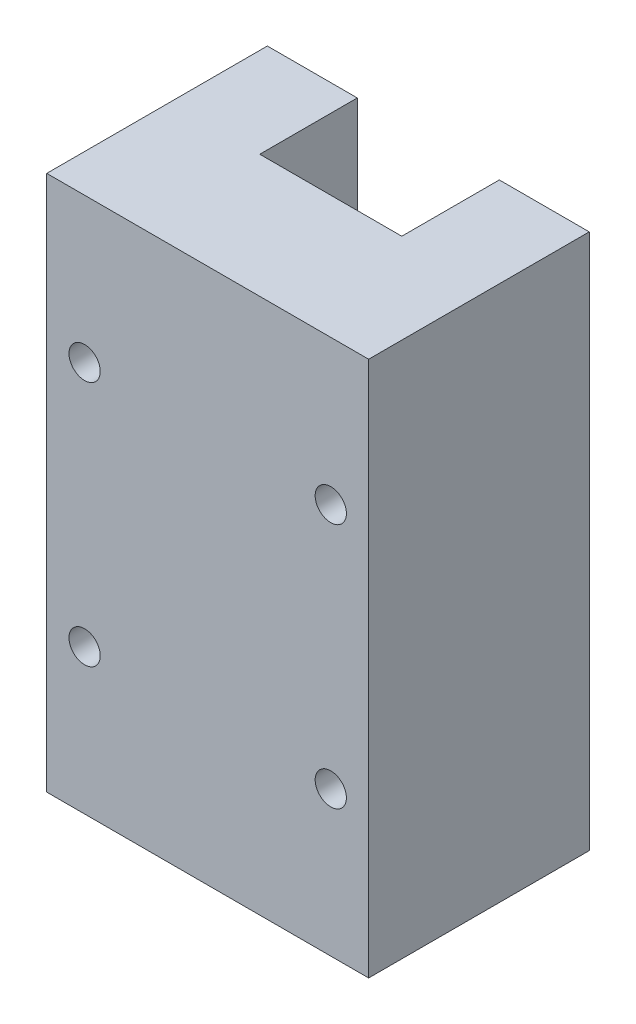
ISO-10303-21;
HEADER;
FILE_DESCRIPTION(('STEP AP214'),'2;1');
FILE_NAME('part.step','',(''),(''),'','','');
FILE_SCHEMA(('AUTOMOTIVE_DESIGN { 1 0 10303 214 1 1 1 1 }'));
ENDSEC;
DATA;
#1=APPLICATION_CONTEXT('core data for automotive mechanical design processes');
#2=APPLICATION_PROTOCOL_DEFINITION('international standard','automotive_design',2000,#1);
#3=PRODUCT_CONTEXT('',#1,'mechanical');
#4=PRODUCT('Part','Part','',(#3));
#5=PRODUCT_RELATED_PRODUCT_CATEGORY('part','',(#4));
#6=PRODUCT_DEFINITION_FORMATION('','',#4);
#7=PRODUCT_DEFINITION_CONTEXT('part definition',#1,'design');
#8=PRODUCT_DEFINITION('design','',#6,#7);
#9=PRODUCT_DEFINITION_SHAPE('','',#8);
#10=(LENGTH_UNIT() NAMED_UNIT(*) SI_UNIT(.MILLI.,.METRE.));
#11=(NAMED_UNIT(*) PLANE_ANGLE_UNIT() SI_UNIT($,.RADIAN.));
#12=(NAMED_UNIT(*) SI_UNIT($,.STERADIAN.) SOLID_ANGLE_UNIT());
#13=UNCERTAINTY_MEASURE_WITH_UNIT(LENGTH_MEASURE(1.E-05),#10,'distance_accuracy_value','');
#14=(GEOMETRIC_REPRESENTATION_CONTEXT(3) GLOBAL_UNCERTAINTY_ASSIGNED_CONTEXT((#13)) GLOBAL_UNIT_ASSIGNED_CONTEXT((#10,
#11,#12)) REPRESENTATION_CONTEXT('',''));
#15=CARTESIAN_POINT('',(0.,0.,0.));
#16=DIRECTION('',(0.,0.,1.));
#17=DIRECTION('',(1.,0.,0.));
#18=AXIS2_PLACEMENT_3D('',#15,#16,#17);
#19=CARTESIAN_POINT('',(-17.,28.3,-23.3));
#20=DIRECTION('',(0.,0.,1.));
#21=DIRECTION('',(1.,0.,0.));
#22=AXIS2_PLACEMENT_3D('',#19,#20,#21);
#23=PLANE('',#22);
#24=DIRECTION('',(-1.,0.,0.));
#25=VECTOR('',#24,1.);
#26=CARTESIAN_POINT('',(-17.,28.3,-23.3));
#27=LINE('',#26,#25);
#28=CARTESIAN_POINT('',(-7.5,28.3,-23.3));
#29=VERTEX_POINT('',#28);
#30=CARTESIAN_POINT('',(-17.,28.3,-23.3));
#31=VERTEX_POINT('',#30);
#32=EDGE_CURVE('E60',#29,#31,#27,.T.);
#33=ORIENTED_EDGE('',*,*,#32,.F.);
#34=DIRECTION('',(0.,1.,0.));
#35=VECTOR('',#34,1.);
#36=CARTESIAN_POINT('',(-7.5,-28.3,-23.3));
#37=LINE('',#36,#35);
#38=CARTESIAN_POINT('',(-7.5,-28.3,-23.3));
#39=VERTEX_POINT('',#38);
#40=EDGE_CURVE('E170',#39,#29,#37,.T.);
#41=ORIENTED_EDGE('',*,*,#40,.F.);
#42=DIRECTION('',(-1.,0.,0.));
#43=VECTOR('',#42,1.);
#44=CARTESIAN_POINT('',(-17.,-28.3,-23.3));
#45=LINE('',#44,#43);
#46=CARTESIAN_POINT('',(-17.,-28.3,-23.3));
#47=VERTEX_POINT('',#46);
#48=EDGE_CURVE('E82',#39,#47,#45,.T.);
#49=ORIENTED_EDGE('',*,*,#48,.T.);
#50=DIRECTION('',(0.,-1.,0.));
#51=VECTOR('',#50,1.);
#52=CARTESIAN_POINT('',(-17.,28.3,-23.3));
#53=LINE('',#52,#51);
#54=EDGE_CURVE('E188',#31,#47,#53,.T.);
#55=ORIENTED_EDGE('',*,*,#54,.F.);
#56=EDGE_LOOP('',(#33,#41,#49,#55));
#57=FACE_BOUND('',#56,.T.);
#58=ADVANCED_FACE('F36',(#57),#23,.F.);
#59=CARTESIAN_POINT('',(-17.,28.3,-23.3));
#60=DIRECTION('',(1.,0.,0.));
#61=DIRECTION('',(0.,0.,-1.));
#62=AXIS2_PLACEMENT_3D('',#59,#60,#61);
#63=PLANE('',#62);
#64=DIRECTION('',(0.,0.,1.));
#65=VECTOR('',#64,1.);
#66=CARTESIAN_POINT('',(-17.,-28.3,-23.3));
#67=LINE('',#66,#65);
#68=CARTESIAN_POINT('',(-17.,-28.3,0.));
#69=VERTEX_POINT('',#68);
#70=EDGE_CURVE('E172',#47,#69,#67,.T.);
#71=ORIENTED_EDGE('',*,*,#70,.T.);
#72=DIRECTION('',(0.,-1.,0.));
#73=VECTOR('',#72,1.);
#74=CARTESIAN_POINT('',(-17.,28.3,0.));
#75=LINE('',#74,#73);
#76=CARTESIAN_POINT('',(-17.,28.3,0.));
#77=VERTEX_POINT('',#76);
#78=EDGE_CURVE('E11',#77,#69,#75,.T.);
#79=ORIENTED_EDGE('',*,*,#78,.F.);
#80=DIRECTION('',(0.,0.,1.));
#81=VECTOR('',#80,1.);
#82=CARTESIAN_POINT('',(-17.,28.3,-23.3));
#83=LINE('',#82,#81);
#84=EDGE_CURVE('E179',#31,#77,#83,.T.);
#85=ORIENTED_EDGE('',*,*,#84,.F.);
#86=ORIENTED_EDGE('',*,*,#54,.T.);
#87=EDGE_LOOP('',(#71,#79,#85,#86));
#88=FACE_BOUND('',#87,.T.);
#89=ADVANCED_FACE('F38',(#88),#63,.F.);
#90=CARTESIAN_POINT('',(-17.,28.3,0.));
#91=DIRECTION('',(0.,0.,-1.));
#92=DIRECTION('',(-1.,0.,0.));
#93=AXIS2_PLACEMENT_3D('',#90,#91,#92);
#94=PLANE('',#93);
#95=CARTESIAN_POINT('',(-13.,13.,0.));
#96=DIRECTION('',(0.,0.,1.));
#97=DIRECTION('',(1.,0.,0.));
#98=AXIS2_PLACEMENT_3D('',#95,#96,#97);
#99=CIRCLE('',#98,1.64999999999999);
#100=CARTESIAN_POINT('',(-11.35,13.,0.));
#101=VERTEX_POINT('',#100);
#102=EDGE_CURVE('E132',#101,#101,#99,.T.);
#103=ORIENTED_EDGE('',*,*,#102,.F.);
#104=EDGE_LOOP('',(#103));
#105=FACE_BOUND('',#104,.T.);
#106=CARTESIAN_POINT('',(-13.,-13.,0.));
#107=DIRECTION('',(0.,0.,1.));
#108=DIRECTION('',(1.,0.,0.));
#109=AXIS2_PLACEMENT_3D('',#106,#107,#108);
#110=CIRCLE('',#109,1.64999999999999);
#111=CARTESIAN_POINT('',(-11.35,-13.,0.));
#112=VERTEX_POINT('',#111);
#113=EDGE_CURVE('E131',#112,#112,#110,.T.);
#114=ORIENTED_EDGE('',*,*,#113,.F.);
#115=EDGE_LOOP('',(#114));
#116=FACE_BOUND('',#115,.T.);
#117=CARTESIAN_POINT('',(13.,-13.,0.));
#118=DIRECTION('',(0.,0.,1.));
#119=DIRECTION('',(1.,0.,0.));
#120=AXIS2_PLACEMENT_3D('',#117,#118,#119);
#121=CIRCLE('',#120,1.64999999999999);
#122=CARTESIAN_POINT('',(14.65,-13.,0.));
#123=VERTEX_POINT('',#122);
#124=EDGE_CURVE('E142',#123,#123,#121,.T.);
#125=ORIENTED_EDGE('',*,*,#124,.F.);
#126=EDGE_LOOP('',(#125));
#127=FACE_BOUND('',#126,.T.);
#128=CARTESIAN_POINT('',(13.,13.,0.));
#129=DIRECTION('',(0.,0.,1.));
#130=DIRECTION('',(1.,0.,0.));
#131=AXIS2_PLACEMENT_3D('',#128,#129,#130);
#132=CIRCLE('',#131,1.64999999999999);
#133=CARTESIAN_POINT('',(14.65,13.,0.));
#134=VERTEX_POINT('',#133);
#135=EDGE_CURVE('E148',#134,#134,#132,.T.);
#136=ORIENTED_EDGE('',*,*,#135,.F.);
#137=EDGE_LOOP('',(#136));
#138=FACE_BOUND('',#137,.T.);
#139=DIRECTION('',(1.,0.,0.));
#140=VECTOR('',#139,1.);
#141=CARTESIAN_POINT('',(-17.,-28.3,0.));
#142=LINE('',#141,#140);
#143=CARTESIAN_POINT('',(17.,-28.3,0.));
#144=VERTEX_POINT('',#143);
#145=EDGE_CURVE('E191',#69,#144,#142,.T.);
#146=ORIENTED_EDGE('',*,*,#145,.T.);
#147=DIRECTION('',(0.,-1.,0.));
#148=VECTOR('',#147,1.);
#149=CARTESIAN_POINT('',(17.,28.3,0.));
#150=LINE('',#149,#148);
#151=CARTESIAN_POINT('',(17.,28.3,0.));
#152=VERTEX_POINT('',#151);
#153=EDGE_CURVE('E44',#152,#144,#150,.T.);
#154=ORIENTED_EDGE('',*,*,#153,.F.);
#155=DIRECTION('',(1.,0.,0.));
#156=VECTOR('',#155,1.);
#157=CARTESIAN_POINT('',(-17.,28.3,0.));
#158=LINE('',#157,#156);
#159=EDGE_CURVE('E89',#77,#152,#158,.T.);
#160=ORIENTED_EDGE('',*,*,#159,.F.);
#161=ORIENTED_EDGE('',*,*,#78,.T.);
#162=EDGE_LOOP('',(#146,#154,#160,#161));
#163=FACE_BOUND('',#162,.T.);
#164=ADVANCED_FACE('F219',(#105,#116,#127,#138,#163),#94,.F.);
#165=CARTESIAN_POINT('',(17.,28.3,-23.3));
#166=DIRECTION('',(-1.,0.,0.));
#167=DIRECTION('',(0.,0.,1.));
#168=AXIS2_PLACEMENT_3D('',#165,#166,#167);
#169=PLANE('',#168);
#170=DIRECTION('',(0.,0.,-1.));
#171=VECTOR('',#170,1.);
#172=CARTESIAN_POINT('',(17.,-28.3,-23.3));
#173=LINE('',#172,#171);
#174=CARTESIAN_POINT('',(17.,-28.3,-23.3));
#175=VERTEX_POINT('',#174);
#176=EDGE_CURVE('E193',#144,#175,#173,.T.);
#177=ORIENTED_EDGE('',*,*,#176,.T.);
#178=DIRECTION('',(0.,-1.,0.));
#179=VECTOR('',#178,1.);
#180=CARTESIAN_POINT('',(17.,28.3,-23.3));
#181=LINE('',#180,#179);
#182=CARTESIAN_POINT('',(17.,28.3,-23.3));
#183=VERTEX_POINT('',#182);
#184=EDGE_CURVE('E198',#183,#175,#181,.T.);
#185=ORIENTED_EDGE('',*,*,#184,.F.);
#186=DIRECTION('',(0.,0.,-1.));
#187=VECTOR('',#186,1.);
#188=CARTESIAN_POINT('',(17.,28.3,-23.3));
#189=LINE('',#188,#187);
#190=EDGE_CURVE('E183',#152,#183,#189,.T.);
#191=ORIENTED_EDGE('',*,*,#190,.F.);
#192=ORIENTED_EDGE('',*,*,#153,.T.);
#193=EDGE_LOOP('',(#177,#185,#191,#192));
#194=FACE_BOUND('',#193,.T.);
#195=ADVANCED_FACE('F204',(#194),#169,.F.);
#196=CARTESIAN_POINT('',(7.5,-28.3,-23.3));
#197=VERTEX_POINT('',#196);
#198=EDGE_CURVE('E181',#175,#197,#45,.T.);
#199=ORIENTED_EDGE('',*,*,#198,.T.);
#200=DIRECTION('',(0.,1.,0.));
#201=VECTOR('',#200,1.);
#202=CARTESIAN_POINT('',(7.5,-28.3,-23.3));
#203=LINE('',#202,#201);
#204=CARTESIAN_POINT('',(7.5,28.3,-23.3));
#205=VERTEX_POINT('',#204);
#206=EDGE_CURVE('E173',#197,#205,#203,.T.);
#207=ORIENTED_EDGE('',*,*,#206,.T.);
#208=EDGE_CURVE('E185',#183,#205,#27,.T.);
#209=ORIENTED_EDGE('',*,*,#208,.F.);
#210=ORIENTED_EDGE('',*,*,#184,.T.);
#211=EDGE_LOOP('',(#199,#207,#209,#210));
#212=FACE_BOUND('',#211,.T.);
#213=ADVANCED_FACE('F211',(#212),#23,.F.);
#214=CARTESIAN_POINT('',(-17.,28.3,0.));
#215=DIRECTION('',(0.,1.,0.));
#216=DIRECTION('',(0.,0.,1.));
#217=AXIS2_PLACEMENT_3D('',#214,#215,#216);
#218=PLANE('',#217);
#219=DIRECTION('',(0.,0.,1.));
#220=VECTOR('',#219,1.);
#221=CARTESIAN_POINT('',(-7.5,28.3,-23.3));
#222=LINE('',#221,#220);
#223=CARTESIAN_POINT('',(-7.5,28.3,-13.));
#224=VERTEX_POINT('',#223);
#225=EDGE_CURVE('E154',#29,#224,#222,.T.);
#226=ORIENTED_EDGE('',*,*,#225,.F.);
#227=ORIENTED_EDGE('',*,*,#32,.T.);
#228=ORIENTED_EDGE('',*,*,#84,.T.);
#229=ORIENTED_EDGE('',*,*,#159,.T.);
#230=ORIENTED_EDGE('',*,*,#190,.T.);
#231=ORIENTED_EDGE('',*,*,#208,.T.);
#232=DIRECTION('',(0.,0.,-1.));
#233=VECTOR('',#232,1.);
#234=CARTESIAN_POINT('',(7.5,28.3,-23.3));
#235=LINE('',#234,#233);
#236=CARTESIAN_POINT('',(7.5,28.3,-13.));
#237=VERTEX_POINT('',#236);
#238=EDGE_CURVE('E159',#237,#205,#235,.T.);
#239=ORIENTED_EDGE('',*,*,#238,.F.);
#240=DIRECTION('',(1.,0.,0.));
#241=VECTOR('',#240,1.);
#242=CARTESIAN_POINT('',(-7.5,28.3,-13.));
#243=LINE('',#242,#241);
#244=EDGE_CURVE('E166',#224,#237,#243,.T.);
#245=ORIENTED_EDGE('',*,*,#244,.F.);
#246=EDGE_LOOP('',(#226,#227,#228,#229,#230,#231,#239,#245));
#247=FACE_BOUND('',#246,.T.);
#248=ADVANCED_FACE('F214',(#247),#218,.T.);
#249=CARTESIAN_POINT('',(-17.,-28.3,0.));
#250=DIRECTION('',(0.,1.,0.));
#251=DIRECTION('',(0.,0.,1.));
#252=AXIS2_PLACEMENT_3D('',#249,#250,#251);
#253=PLANE('',#252);
#254=ORIENTED_EDGE('',*,*,#48,.F.);
#255=DIRECTION('',(0.,0.,1.));
#256=VECTOR('',#255,1.);
#257=CARTESIAN_POINT('',(-7.5,-28.3,-23.3));
#258=LINE('',#257,#256);
#259=CARTESIAN_POINT('',(-7.5,-28.3,-13.));
#260=VERTEX_POINT('',#259);
#261=EDGE_CURVE('E155',#39,#260,#258,.T.);
#262=ORIENTED_EDGE('',*,*,#261,.T.);
#263=DIRECTION('',(1.,0.,0.));
#264=VECTOR('',#263,1.);
#265=CARTESIAN_POINT('',(-7.5,-28.3,-13.));
#266=LINE('',#265,#264);
#267=CARTESIAN_POINT('',(7.5,-28.3,-13.));
#268=VERTEX_POINT('',#267);
#269=EDGE_CURVE('E158',#260,#268,#266,.T.);
#270=ORIENTED_EDGE('',*,*,#269,.T.);
#271=DIRECTION('',(0.,0.,-1.));
#272=VECTOR('',#271,1.);
#273=CARTESIAN_POINT('',(7.5,-28.3,-23.3));
#274=LINE('',#273,#272);
#275=EDGE_CURVE('E51',#268,#197,#274,.T.);
#276=ORIENTED_EDGE('',*,*,#275,.T.);
#277=ORIENTED_EDGE('',*,*,#198,.F.);
#278=ORIENTED_EDGE('',*,*,#176,.F.);
#279=ORIENTED_EDGE('',*,*,#145,.F.);
#280=ORIENTED_EDGE('',*,*,#70,.F.);
#281=EDGE_LOOP('',(#254,#262,#270,#276,#277,#278,#279,#280));
#282=FACE_BOUND('',#281,.T.);
#283=ADVANCED_FACE('F208',(#282),#253,.F.);
#284=CARTESIAN_POINT('',(-7.5,-28.3,-23.3));
#285=DIRECTION('',(-1.,0.,0.));
#286=DIRECTION('',(0.,0.,1.));
#287=AXIS2_PLACEMENT_3D('',#284,#285,#286);
#288=PLANE('',#287);
#289=ORIENTED_EDGE('',*,*,#225,.T.);
#290=DIRECTION('',(0.,1.,0.));
#291=VECTOR('',#290,1.);
#292=CARTESIAN_POINT('',(-7.5,-28.3,-13.));
#293=LINE('',#292,#291);
#294=EDGE_CURVE('E163',#260,#224,#293,.T.);
#295=ORIENTED_EDGE('',*,*,#294,.F.);
#296=ORIENTED_EDGE('',*,*,#261,.F.);
#297=ORIENTED_EDGE('',*,*,#40,.T.);
#298=EDGE_LOOP('',(#289,#295,#296,#297));
#299=FACE_BOUND('',#298,.T.);
#300=ADVANCED_FACE('F242',(#299),#288,.F.);
#301=CARTESIAN_POINT('',(7.5,-28.3,-23.3));
#302=DIRECTION('',(1.,0.,0.));
#303=DIRECTION('',(0.,0.,-1.));
#304=AXIS2_PLACEMENT_3D('',#301,#302,#303);
#305=PLANE('',#304);
#306=ORIENTED_EDGE('',*,*,#238,.T.);
#307=ORIENTED_EDGE('',*,*,#206,.F.);
#308=ORIENTED_EDGE('',*,*,#275,.F.);
#309=DIRECTION('',(0.,1.,0.));
#310=VECTOR('',#309,1.);
#311=CARTESIAN_POINT('',(7.5,-28.3,-13.));
#312=LINE('',#311,#310);
#313=EDGE_CURVE('E176',#268,#237,#312,.T.);
#314=ORIENTED_EDGE('',*,*,#313,.T.);
#315=EDGE_LOOP('',(#306,#307,#308,#314));
#316=FACE_BOUND('',#315,.T.);
#317=ADVANCED_FACE('F246',(#316),#305,.F.);
#318=CARTESIAN_POINT('',(-7.5,-28.3,-13.));
#319=DIRECTION('',(0.,0.,1.));
#320=DIRECTION('',(1.,0.,0.));
#321=AXIS2_PLACEMENT_3D('',#318,#319,#320);
#322=PLANE('',#321);
#323=ORIENTED_EDGE('',*,*,#244,.T.);
#324=ORIENTED_EDGE('',*,*,#313,.F.);
#325=ORIENTED_EDGE('',*,*,#269,.F.);
#326=ORIENTED_EDGE('',*,*,#294,.T.);
#327=EDGE_LOOP('',(#323,#324,#325,#326));
#328=FACE_BOUND('',#327,.T.);
#329=ADVANCED_FACE('F248',(#328),#322,.F.);
#330=CARTESIAN_POINT('',(13.,13.,-10.1));
#331=DIRECTION('',(0.,0.,1.));
#332=DIRECTION('',(1.,0.,0.));
#333=AXIS2_PLACEMENT_3D('',#330,#331,#332);
#334=CONICAL_SURFACE('',#333,1.65,1.02974425867665);
#335=CARTESIAN_POINT('',(13.,13.,-11.0914200213955));
#336=VERTEX_POINT('',#335);
#337=VERTEX_LOOP('',#336);
#338=FACE_BOUND('',#337,.T.);
#339=CARTESIAN_POINT('',(13.,13.,-10.1));
#340=DIRECTION('',(0.,0.,1.));
#341=DIRECTION('',(1.,0.,0.));
#342=AXIS2_PLACEMENT_3D('',#339,#340,#341);
#343=CIRCLE('',#342,1.65);
#344=CARTESIAN_POINT('',(14.65,13.,-10.1));
#345=VERTEX_POINT('',#344);
#346=EDGE_CURVE('E151',#345,#345,#343,.T.);
#347=ORIENTED_EDGE('',*,*,#346,.T.);
#348=EDGE_LOOP('',(#347));
#349=FACE_BOUND('',#348,.T.);
#350=ADVANCED_FACE('F251',(#338,#349),#334,.F.);
#351=CARTESIAN_POINT('',(13.,13.,0.));
#352=DIRECTION('',(0.,0.,1.));
#353=DIRECTION('',(1.,0.,0.));
#354=AXIS2_PLACEMENT_3D('',#351,#352,#353);
#355=CYLINDRICAL_SURFACE('',#354,1.64999999999999);
#356=ORIENTED_EDGE('',*,*,#346,.F.);
#357=EDGE_LOOP('',(#356));
#358=FACE_BOUND('',#357,.T.);
#359=ORIENTED_EDGE('',*,*,#135,.T.);
#360=EDGE_LOOP('',(#359));
#361=FACE_BOUND('',#360,.T.);
#362=ADVANCED_FACE('F257',(#358,#361),#355,.F.);
#363=CARTESIAN_POINT('',(13.,-13.,-10.1));
#364=DIRECTION('',(0.,0.,1.));
#365=DIRECTION('',(1.,0.,0.));
#366=AXIS2_PLACEMENT_3D('',#363,#364,#365);
#367=CONICAL_SURFACE('',#366,1.65,1.02974425867665);
#368=CARTESIAN_POINT('',(13.,-13.,-11.0914200213955));
#369=VERTEX_POINT('',#368);
#370=VERTEX_LOOP('',#369);
#371=FACE_BOUND('',#370,.T.);
#372=CARTESIAN_POINT('',(13.,-13.,-10.1));
#373=DIRECTION('',(0.,0.,1.));
#374=DIRECTION('',(1.,0.,0.));
#375=AXIS2_PLACEMENT_3D('',#372,#373,#374);
#376=CIRCLE('',#375,1.65);
#377=CARTESIAN_POINT('',(14.65,-13.,-10.1));
#378=VERTEX_POINT('',#377);
#379=EDGE_CURVE('E145',#378,#378,#376,.T.);
#380=ORIENTED_EDGE('',*,*,#379,.T.);
#381=EDGE_LOOP('',(#380));
#382=FACE_BOUND('',#381,.T.);
#383=ADVANCED_FACE('F261',(#371,#382),#367,.F.);
#384=CARTESIAN_POINT('',(13.,-13.,0.));
#385=DIRECTION('',(0.,0.,1.));
#386=DIRECTION('',(1.,0.,0.));
#387=AXIS2_PLACEMENT_3D('',#384,#385,#386);
#388=CYLINDRICAL_SURFACE('',#387,1.64999999999999);
#389=ORIENTED_EDGE('',*,*,#379,.F.);
#390=EDGE_LOOP('',(#389));
#391=FACE_BOUND('',#390,.T.);
#392=ORIENTED_EDGE('',*,*,#124,.T.);
#393=EDGE_LOOP('',(#392));
#394=FACE_BOUND('',#393,.T.);
#395=ADVANCED_FACE('F265',(#391,#394),#388,.F.);
#396=CARTESIAN_POINT('',(-13.,-13.,-10.1));
#397=DIRECTION('',(0.,0.,1.));
#398=DIRECTION('',(1.,0.,0.));
#399=AXIS2_PLACEMENT_3D('',#396,#397,#398);
#400=CONICAL_SURFACE('',#399,1.65,1.02974425867665);
#401=CARTESIAN_POINT('',(-13.,-13.,-11.0914200213955));
#402=VERTEX_POINT('',#401);
#403=VERTEX_LOOP('',#402);
#404=FACE_BOUND('',#403,.T.);
#405=CARTESIAN_POINT('',(-13.,-13.,-10.1));
#406=DIRECTION('',(0.,0.,1.));
#407=DIRECTION('',(1.,0.,0.));
#408=AXIS2_PLACEMENT_3D('',#405,#406,#407);
#409=CIRCLE('',#408,1.65);
#410=CARTESIAN_POINT('',(-11.35,-13.,-10.1));
#411=VERTEX_POINT('',#410);
#412=EDGE_CURVE('E135',#411,#411,#409,.T.);
#413=ORIENTED_EDGE('',*,*,#412,.T.);
#414=EDGE_LOOP('',(#413));
#415=FACE_BOUND('',#414,.T.);
#416=ADVANCED_FACE('F269',(#404,#415),#400,.F.);
#417=CARTESIAN_POINT('',(-13.,-13.,0.));
#418=DIRECTION('',(0.,0.,1.));
#419=DIRECTION('',(1.,0.,0.));
#420=AXIS2_PLACEMENT_3D('',#417,#418,#419);
#421=CYLINDRICAL_SURFACE('',#420,1.64999999999999);
#422=ORIENTED_EDGE('',*,*,#412,.F.);
#423=EDGE_LOOP('',(#422));
#424=FACE_BOUND('',#423,.T.);
#425=ORIENTED_EDGE('',*,*,#113,.T.);
#426=EDGE_LOOP('',(#425));
#427=FACE_BOUND('',#426,.T.);
#428=ADVANCED_FACE('F125',(#424,#427),#421,.F.);
#429=CARTESIAN_POINT('',(-13.,13.,-10.1));
#430=DIRECTION('',(0.,0.,1.));
#431=DIRECTION('',(1.,0.,0.));
#432=AXIS2_PLACEMENT_3D('',#429,#430,#431);
#433=CONICAL_SURFACE('',#432,1.65,1.02974425867665);
#434=CARTESIAN_POINT('',(-13.,13.,-11.0914200213955));
#435=VERTEX_POINT('',#434);
#436=VERTEX_LOOP('',#435);
#437=FACE_BOUND('',#436,.T.);
#438=CARTESIAN_POINT('',(-13.,13.,-10.1));
#439=DIRECTION('',(0.,0.,1.));
#440=DIRECTION('',(1.,0.,0.));
#441=AXIS2_PLACEMENT_3D('',#438,#439,#440);
#442=CIRCLE('',#441,1.65);
#443=CARTESIAN_POINT('',(-11.35,13.,-10.1));
#444=VERTEX_POINT('',#443);
#445=EDGE_CURVE('E129',#444,#444,#442,.T.);
#446=ORIENTED_EDGE('',*,*,#445,.T.);
#447=EDGE_LOOP('',(#446));
#448=FACE_BOUND('',#447,.T.);
#449=ADVANCED_FACE('F121',(#437,#448),#433,.F.);
#450=CARTESIAN_POINT('',(-13.,13.,0.));
#451=DIRECTION('',(0.,0.,1.));
#452=DIRECTION('',(1.,0.,0.));
#453=AXIS2_PLACEMENT_3D('',#450,#451,#452);
#454=CYLINDRICAL_SURFACE('',#453,1.64999999999999);
#455=ORIENTED_EDGE('',*,*,#445,.F.);
#456=EDGE_LOOP('',(#455));
#457=FACE_BOUND('',#456,.T.);
#458=ORIENTED_EDGE('',*,*,#102,.T.);
#459=EDGE_LOOP('',(#458));
#460=FACE_BOUND('',#459,.T.);
#461=ADVANCED_FACE('F124',(#457,#460),#454,.F.);
#462=CLOSED_SHELL('',(#58,#89,#164,#195,#213,#248,#283,#300,#317,#329,#350,#362,#383,#395,#416,
#428,#449,#461));
#463=MANIFOLD_SOLID_BREP('B2',#462);
#464=ADVANCED_BREP_SHAPE_REPRESENTATION('',(#18,#463),#14);
#465=SHAPE_DEFINITION_REPRESENTATION(#9,#464);
ENDSEC;
END-ISO-10303-21;
